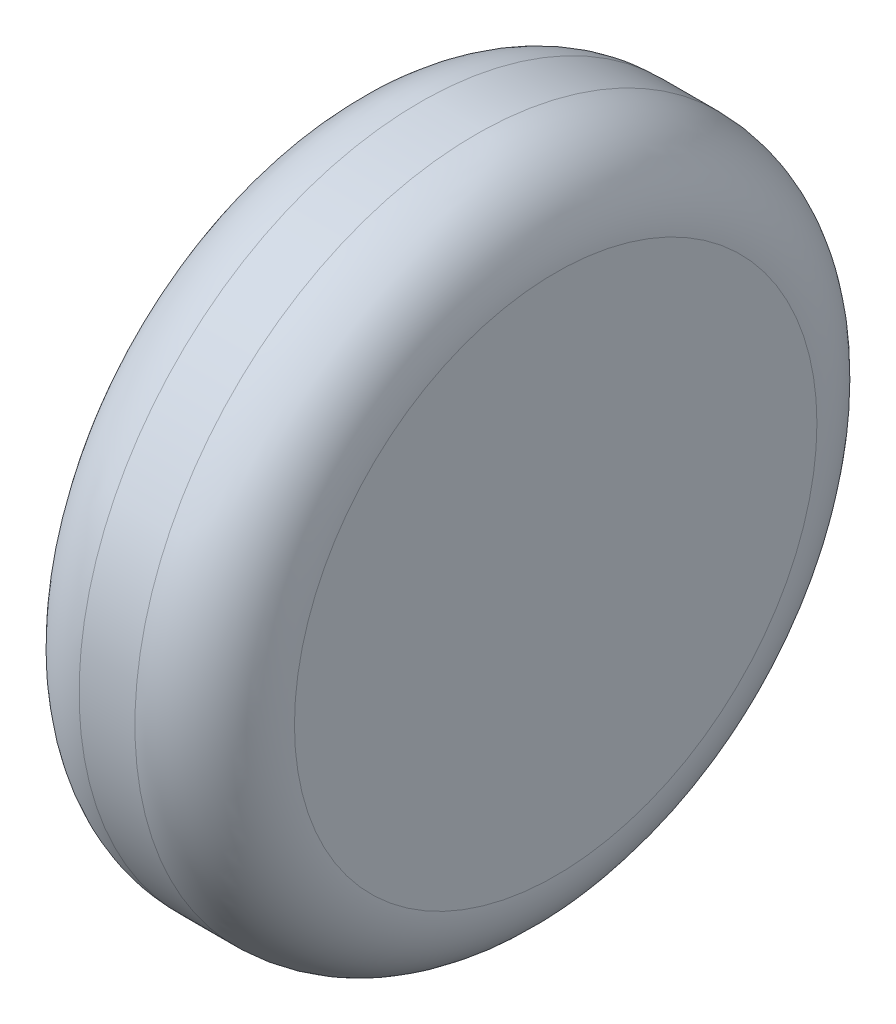
ISO-10303-21;
HEADER;
FILE_DESCRIPTION(('STEP AP214'),'2;1');
FILE_NAME('part.step','',(''),(''),'','','');
FILE_SCHEMA(('AUTOMOTIVE_DESIGN { 1 0 10303 214 1 1 1 1 }'));
ENDSEC;
DATA;
#1=APPLICATION_CONTEXT('core data for automotive mechanical design processes');
#2=APPLICATION_PROTOCOL_DEFINITION('international standard','automotive_design',2000,#1);
#3=PRODUCT_CONTEXT('',#1,'mechanical');
#4=PRODUCT('Part','Part','',(#3));
#5=PRODUCT_RELATED_PRODUCT_CATEGORY('part','',(#4));
#6=PRODUCT_DEFINITION_FORMATION('','',#4);
#7=PRODUCT_DEFINITION_CONTEXT('part definition',#1,'design');
#8=PRODUCT_DEFINITION('design','',#6,#7);
#9=PRODUCT_DEFINITION_SHAPE('','',#8);
#10=(LENGTH_UNIT() NAMED_UNIT(*) SI_UNIT(.MILLI.,.METRE.));
#11=(NAMED_UNIT(*) PLANE_ANGLE_UNIT() SI_UNIT($,.RADIAN.));
#12=(NAMED_UNIT(*) SI_UNIT($,.STERADIAN.) SOLID_ANGLE_UNIT());
#13=UNCERTAINTY_MEASURE_WITH_UNIT(LENGTH_MEASURE(1.E-05),#10,'distance_accuracy_value','');
#14=(GEOMETRIC_REPRESENTATION_CONTEXT(3) GLOBAL_UNCERTAINTY_ASSIGNED_CONTEXT((#13)) GLOBAL_UNIT_ASSIGNED_CONTEXT((#10,
#11,#12)) REPRESENTATION_CONTEXT('',''));
#15=CARTESIAN_POINT('',(0.,0.,0.));
#16=DIRECTION('',(0.,0.,1.));
#17=DIRECTION('',(1.,0.,0.));
#18=AXIS2_PLACEMENT_3D('',#15,#16,#17);
#19=CARTESIAN_POINT('',(24.,0.,0.));
#20=DIRECTION('',(-1.,0.,0.));
#21=DIRECTION('',(0.,0.,1.));
#22=AXIS2_PLACEMENT_3D('',#19,#20,#21);
#23=CYLINDRICAL_SURFACE('',#22,38.);
#24=CARTESIAN_POINT('',(15.11,0.,0.));
#25=DIRECTION('',(1.,0.,0.));
#26=DIRECTION('',(0.,0.,-1.));
#27=AXIS2_PLACEMENT_3D('',#24,#25,#26);
#28=CIRCLE('',#27,38.);
#29=CARTESIAN_POINT('',(15.11,0.,-38.));
#30=VERTEX_POINT('',#29);
#31=EDGE_CURVE('E88',#30,#30,#28,.F.);
#32=ORIENTED_EDGE('',*,*,#31,.T.);
#33=EDGE_LOOP('',(#32));
#34=FACE_BOUND('',#33,.T.);
#35=CARTESIAN_POINT('',(8.89,0.,0.));
#36=DIRECTION('',(1.,0.,0.));
#37=DIRECTION('',(0.,0.,-1.));
#38=AXIS2_PLACEMENT_3D('',#35,#36,#37);
#39=CIRCLE('',#38,38.);
#40=CARTESIAN_POINT('',(8.89,0.,-38.));
#41=VERTEX_POINT('',#40);
#42=EDGE_CURVE('E85',#41,#41,#39,.T.);
#43=ORIENTED_EDGE('',*,*,#42,.T.);
#44=EDGE_LOOP('',(#43));
#45=FACE_BOUND('',#44,.T.);
#46=ADVANCED_FACE('F33',(#34,#45),#23,.T.);
#47=CARTESIAN_POINT('',(24.,0.,0.));
#48=DIRECTION('',(1.,0.,0.));
#49=DIRECTION('',(0.,0.,-1.));
#50=AXIS2_PLACEMENT_3D('',#47,#48,#49);
#51=PLANE('',#50);
#52=CARTESIAN_POINT('',(24.,0.,0.));
#53=DIRECTION('',(1.,0.,0.));
#54=DIRECTION('',(0.,0.,-1.));
#55=AXIS2_PLACEMENT_3D('',#52,#53,#54);
#56=CIRCLE('',#55,29.11);
#57=CARTESIAN_POINT('',(24.,0.,-29.11));
#58=VERTEX_POINT('',#57);
#59=EDGE_CURVE('E82',#58,#58,#56,.T.);
#60=ORIENTED_EDGE('',*,*,#59,.T.);
#61=EDGE_LOOP('',(#60));
#62=FACE_BOUND('',#61,.T.);
#63=ADVANCED_FACE('F102',(#62),#51,.T.);
#64=CARTESIAN_POINT('',(0.,0.,0.));
#65=DIRECTION('',(1.,0.,0.));
#66=DIRECTION('',(0.,0.,-1.));
#67=AXIS2_PLACEMENT_3D('',#64,#65,#66);
#68=PLANE('',#67);
#69=CARTESIAN_POINT('',(0.,0.,0.));
#70=DIRECTION('',(1.,0.,0.));
#71=DIRECTION('',(0.,0.,-1.));
#72=AXIS2_PLACEMENT_3D('',#69,#70,#71);
#73=CIRCLE('',#72,10.922);
#74=CARTESIAN_POINT('',(0.,0.,-10.922));
#75=VERTEX_POINT('',#74);
#76=EDGE_CURVE('E11',#75,#75,#73,.F.);
#77=ORIENTED_EDGE('',*,*,#76,.F.);
#78=EDGE_LOOP('',(#77));
#79=FACE_BOUND('',#78,.T.);
#80=CARTESIAN_POINT('',(0.,0.,0.));
#81=DIRECTION('',(1.,0.,0.));
#82=DIRECTION('',(0.,0.,-1.));
#83=AXIS2_PLACEMENT_3D('',#80,#81,#82);
#84=CIRCLE('',#83,29.11);
#85=CARTESIAN_POINT('',(0.,0.,-29.11));
#86=VERTEX_POINT('',#85);
#87=EDGE_CURVE('E41',#86,#86,#84,.F.);
#88=ORIENTED_EDGE('',*,*,#87,.T.);
#89=EDGE_LOOP('',(#88));
#90=FACE_BOUND('',#89,.T.);
#91=ADVANCED_FACE('F93',(#79,#90),#68,.F.);
#92=CARTESIAN_POINT('',(15.11,0.,0.));
#93=DIRECTION('',(1.,0.,0.));
#94=DIRECTION('',(0.,0.,-1.));
#95=AXIS2_PLACEMENT_3D('',#92,#93,#94);
#96=TOROIDAL_SURFACE('',#95,29.11,8.89);
#97=ORIENTED_EDGE('',*,*,#31,.F.);
#98=EDGE_LOOP('',(#97));
#99=FACE_BOUND('',#98,.T.);
#100=ORIENTED_EDGE('',*,*,#59,.F.);
#101=EDGE_LOOP('',(#100));
#102=FACE_BOUND('',#101,.T.);
#103=ADVANCED_FACE('F98',(#99,#102),#96,.T.);
#104=CARTESIAN_POINT('',(8.89,0.,0.));
#105=DIRECTION('',(1.,0.,0.));
#106=DIRECTION('',(0.,0.,-1.));
#107=AXIS2_PLACEMENT_3D('',#104,#105,#106);
#108=TOROIDAL_SURFACE('',#107,29.11,8.89);
#109=ORIENTED_EDGE('',*,*,#87,.F.);
#110=EDGE_LOOP('',(#109));
#111=FACE_BOUND('',#110,.T.);
#112=ORIENTED_EDGE('',*,*,#42,.F.);
#113=EDGE_LOOP('',(#112));
#114=FACE_BOUND('',#113,.T.);
#115=ADVANCED_FACE('F35',(#111,#114),#108,.T.);
#116=CARTESIAN_POINT('',(-3.302,0.,0.));
#117=DIRECTION('',(1.,0.,0.));
#118=DIRECTION('',(0.,0.,-1.));
#119=AXIS2_PLACEMENT_3D('',#116,#117,#118);
#120=CYLINDRICAL_SURFACE('',#119,10.922);
#121=CARTESIAN_POINT('',(-3.302,0.,0.));
#122=DIRECTION('',(-1.,0.,0.));
#123=DIRECTION('',(0.,0.,1.));
#124=AXIS2_PLACEMENT_3D('',#121,#122,#123);
#125=CIRCLE('',#124,10.922);
#126=CARTESIAN_POINT('',(-3.302,0.,-10.922));
#127=VERTEX_POINT('',#126);
#128=EDGE_CURVE('E64',#127,#127,#125,.T.);
#129=CARTESIAN_POINT('',(-3.302,0.,-10.922));
#130=CARTESIAN_POINT('',(-3.26760416666667,0.,-10.922));
#131=CARTESIAN_POINT('',(-3.23320833333333,0.,-10.922));
#132=CARTESIAN_POINT('',(-3.16441666666667,0.,-10.922));
#133=CARTESIAN_POINT('',(-3.13002083333333,0.,-10.922));
#134=CARTESIAN_POINT('',(-3.06122916666667,0.,-10.922));
#135=CARTESIAN_POINT('',(-3.02683333333333,0.,-10.922));
#136=CARTESIAN_POINT('',(-2.95804166666667,0.,-10.922));
#137=CARTESIAN_POINT('',(-2.92364583333333,0.,-10.922));
#138=CARTESIAN_POINT('',(-2.85485416666667,0.,-10.922));
#139=CARTESIAN_POINT('',(-2.82045833333333,0.,-10.922));
#140=CARTESIAN_POINT('',(-2.75166666666667,0.,-10.922));
#141=CARTESIAN_POINT('',(-2.71727083333333,0.,-10.922));
#142=CARTESIAN_POINT('',(-2.64847916666667,0.,-10.922));
#143=CARTESIAN_POINT('',(-2.61408333333333,0.,-10.922));
#144=CARTESIAN_POINT('',(-2.54529166666667,0.,-10.922));
#145=CARTESIAN_POINT('',(-2.51089583333333,0.,-10.922));
#146=CARTESIAN_POINT('',(-2.44210416666667,0.,-10.922));
#147=CARTESIAN_POINT('',(-2.40770833333333,0.,-10.922));
#148=CARTESIAN_POINT('',(-2.33891666666667,0.,-10.922));
#149=CARTESIAN_POINT('',(-2.30452083333333,0.,-10.922));
#150=CARTESIAN_POINT('',(-2.23572916666667,0.,-10.922));
#151=CARTESIAN_POINT('',(-2.20133333333333,0.,-10.922));
#152=CARTESIAN_POINT('',(-2.13254166666667,0.,-10.922));
#153=CARTESIAN_POINT('',(-2.09814583333333,0.,-10.922));
#154=CARTESIAN_POINT('',(-2.02935416666667,0.,-10.922));
#155=CARTESIAN_POINT('',(-1.99495833333333,0.,-10.922));
#156=CARTESIAN_POINT('',(-1.92616666666667,0.,-10.922));
#157=CARTESIAN_POINT('',(-1.89177083333333,0.,-10.922));
#158=CARTESIAN_POINT('',(-1.82297916666667,0.,-10.922));
#159=CARTESIAN_POINT('',(-1.78858333333333,0.,-10.922));
#160=CARTESIAN_POINT('',(-1.71979166666667,0.,-10.922));
#161=CARTESIAN_POINT('',(-1.68539583333333,0.,-10.922));
#162=CARTESIAN_POINT('',(-1.61660416666667,0.,-10.922));
#163=CARTESIAN_POINT('',(-1.58220833333333,0.,-10.922));
#164=CARTESIAN_POINT('',(-1.51341666666667,0.,-10.922));
#165=CARTESIAN_POINT('',(-1.47902083333333,0.,-10.922));
#166=CARTESIAN_POINT('',(-1.41022916666667,0.,-10.922));
#167=CARTESIAN_POINT('',(-1.37583333333333,0.,-10.922));
#168=CARTESIAN_POINT('',(-1.30704166666667,0.,-10.922));
#169=CARTESIAN_POINT('',(-1.27264583333333,0.,-10.922));
#170=CARTESIAN_POINT('',(-1.20385416666667,0.,-10.922));
#171=CARTESIAN_POINT('',(-1.16945833333333,0.,-10.922));
#172=CARTESIAN_POINT('',(-1.10066666666667,0.,-10.922));
#173=CARTESIAN_POINT('',(-1.06627083333333,0.,-10.922));
#174=CARTESIAN_POINT('',(-0.997479166666667,0.,-10.922));
#175=CARTESIAN_POINT('',(-0.963083333333334,0.,-10.922));
#176=CARTESIAN_POINT('',(-0.894291666666667,0.,-10.922));
#177=CARTESIAN_POINT('',(-0.859895833333333,0.,-10.922));
#178=CARTESIAN_POINT('',(-0.791104166666666,0.,-10.922));
#179=CARTESIAN_POINT('',(-0.756708333333333,0.,-10.922));
#180=CARTESIAN_POINT('',(-0.687916666666667,0.,-10.922));
#181=CARTESIAN_POINT('',(-0.653520833333333,0.,-10.922));
#182=CARTESIAN_POINT('',(-0.584729166666667,0.,-10.922));
#183=CARTESIAN_POINT('',(-0.550333333333333,0.,-10.922));
#184=CARTESIAN_POINT('',(-0.481541666666667,0.,-10.922));
#185=CARTESIAN_POINT('',(-0.447145833333333,0.,-10.922));
#186=CARTESIAN_POINT('',(-0.378354166666667,0.,-10.922));
#187=CARTESIAN_POINT('',(-0.343958333333333,0.,-10.922));
#188=CARTESIAN_POINT('',(-0.275166666666667,0.,-10.922));
#189=CARTESIAN_POINT('',(-0.240770833333333,0.,-10.922));
#190=CARTESIAN_POINT('',(-0.171979166666667,0.,-10.922));
#191=CARTESIAN_POINT('',(-0.137583333333333,0.,-10.922));
#192=CARTESIAN_POINT('',(-0.0687916666666666,0.,-10.922));
#193=CARTESIAN_POINT('',(-0.0343958333333333,0.,-10.922));
#194=CARTESIAN_POINT('',(0.,0.,-10.922));
#195=B_SPLINE_CURVE_WITH_KNOTS('',3,(#129,#130,#131,#132,#133,#134,#135,#136,#137,#138,#139,
#140,#141,#142,#143,#144,#145,#146,#147,#148,#149,#150,#151,#152,#153,#154,#155,#156,#157,#158,
#159,#160,#161,#162,#163,#164,#165,#166,#167,#168,#169,#170,#171,#172,#173,#174,#175,#176,#177,
#178,#179,#180,#181,#182,#183,#184,#185,#186,#187,#188,#189,#190,#191,#192,#193,#194),
.UNSPECIFIED.,.F.,.F.,(4,2,2,2,2,2,2,2,2,2,2,2,2,2,2,2,2,2,2,2,2,2,2,2,2,2,2,2,2,2,2,2,4),(0.,
0.1031875,0.206375,0.3095625,0.41275,0.5159375,0.619125,0.7223125,0.8255,0.9286875,1.031875,
1.1350625,1.23825,1.3414375,1.444625,1.5478125,1.651,1.7541875,1.857375,1.9605625,2.06375,
2.1669375,2.270125,2.3733125,2.4765,2.5796875,2.682875,2.7860625,2.88925,2.9924375,3.095625,
3.1988125,3.302),.UNSPECIFIED.);
#196=EDGE_CURVE('BSEAM97',#127,#75,#195,.T.);
#197=ORIENTED_EDGE('',*,*,#128,.F.);
#198=ORIENTED_EDGE('',*,*,#76,.T.);
#199=ORIENTED_EDGE('',*,*,#196,.T.);
#200=ORIENTED_EDGE('',*,*,#196,.F.);
#201=EDGE_LOOP('',(#197,#199,#198,#200));
#202=FACE_BOUND('',#201,.T.);
#203=ADVANCED_FACE('F97',(#202),#120,.T.);
#204=CARTESIAN_POINT('',(-3.302,0.,0.));
#205=DIRECTION('',(-1.,0.,0.));
#206=DIRECTION('',(0.,0.,1.));
#207=AXIS2_PLACEMENT_3D('',#204,#205,#206);
#208=PLANE('',#207);
#209=CARTESIAN_POINT('',(-3.302,0.,0.));
#210=DIRECTION('',(-1.,0.,0.));
#211=DIRECTION('',(0.,0.,1.));
#212=AXIS2_PLACEMENT_3D('',#209,#210,#211);
#213=CIRCLE('',#212,3.);
#214=CARTESIAN_POINT('',(-3.302,2.5,-1.6583123951777));
#215=VERTEX_POINT('',#214);
#216=CARTESIAN_POINT('',(-3.302,2.5,1.6583123951777));
#217=VERTEX_POINT('',#216);
#218=EDGE_CURVE('E48',#215,#217,#213,.T.);
#219=ORIENTED_EDGE('',*,*,#218,.F.);
#220=DIRECTION('',(0.,0.,-1.));
#221=VECTOR('',#220,1.);
#222=CARTESIAN_POINT('',(-3.302,2.5,-1.6583123951777));
#223=LINE('',#222,#221);
#224=EDGE_CURVE('E68',#217,#215,#223,.T.);
#225=ORIENTED_EDGE('',*,*,#224,.F.);
#226=EDGE_LOOP('',(#219,#225));
#227=FACE_BOUND('',#226,.T.);
#228=ORIENTED_EDGE('',*,*,#128,.T.);
#229=EDGE_LOOP('',(#228));
#230=FACE_BOUND('',#229,.T.);
#231=ADVANCED_FACE('F72',(#227,#230),#208,.T.);
#232=CARTESIAN_POINT('',(14.224,0.,0.));
#233=DIRECTION('',(-1.,0.,0.));
#234=DIRECTION('',(0.,0.,1.));
#235=AXIS2_PLACEMENT_3D('',#232,#233,#234);
#236=CYLINDRICAL_SURFACE('',#235,3.);
#237=ORIENTED_EDGE('',*,*,#218,.T.);
#238=DIRECTION('',(-1.,0.,0.));
#239=VECTOR('',#238,1.);
#240=CARTESIAN_POINT('',(14.224,2.5,1.6583123951777));
#241=LINE('',#240,#239);
#242=CARTESIAN_POINT('',(14.224,2.5,1.6583123951777));
#243=VERTEX_POINT('',#242);
#244=EDGE_CURVE('E65',#243,#217,#241,.T.);
#245=ORIENTED_EDGE('',*,*,#244,.F.);
#246=CARTESIAN_POINT('',(14.224,0.,0.));
#247=DIRECTION('',(-1.,0.,0.));
#248=DIRECTION('',(0.,0.,1.));
#249=AXIS2_PLACEMENT_3D('',#246,#247,#248);
#250=CIRCLE('',#249,3.);
#251=CARTESIAN_POINT('',(14.224,2.5,-1.6583123951777));
#252=VERTEX_POINT('',#251);
#253=EDGE_CURVE('E62',#252,#243,#250,.T.);
#254=ORIENTED_EDGE('',*,*,#253,.F.);
#255=DIRECTION('',(-1.,0.,0.));
#256=VECTOR('',#255,1.);
#257=CARTESIAN_POINT('',(14.224,2.5,-1.6583123951777));
#258=LINE('',#257,#256);
#259=EDGE_CURVE('E56',#252,#215,#258,.T.);
#260=ORIENTED_EDGE('',*,*,#259,.T.);
#261=EDGE_LOOP('',(#237,#245,#254,#260));
#262=FACE_BOUND('',#261,.T.);
#263=ADVANCED_FACE('F60',(#262),#236,.F.);
#264=CARTESIAN_POINT('',(14.224,2.5,-1.6583123951777));
#265=DIRECTION('',(0.,1.,0.));
#266=DIRECTION('',(0.,0.,1.));
#267=AXIS2_PLACEMENT_3D('',#264,#265,#266);
#268=PLANE('',#267);
#269=ORIENTED_EDGE('',*,*,#224,.T.);
#270=ORIENTED_EDGE('',*,*,#259,.F.);
#271=DIRECTION('',(0.,0.,-1.));
#272=VECTOR('',#271,1.);
#273=CARTESIAN_POINT('',(14.224,2.5,-1.6583123951777));
#274=LINE('',#273,#272);
#275=EDGE_CURVE('E76',#243,#252,#274,.T.);
#276=ORIENTED_EDGE('',*,*,#275,.F.);
#277=ORIENTED_EDGE('',*,*,#244,.T.);
#278=EDGE_LOOP('',(#269,#270,#276,#277));
#279=FACE_BOUND('',#278,.T.);
#280=ADVANCED_FACE('F69',(#279),#268,.F.);
#281=CARTESIAN_POINT('',(14.224,0.,0.));
#282=DIRECTION('',(-1.,0.,0.));
#283=DIRECTION('',(0.,0.,1.));
#284=AXIS2_PLACEMENT_3D('',#281,#282,#283);
#285=PLANE('',#284);
#286=ORIENTED_EDGE('',*,*,#253,.T.);
#287=ORIENTED_EDGE('',*,*,#275,.T.);
#288=EDGE_LOOP('',(#286,#287));
#289=FACE_BOUND('',#288,.T.);
#290=ADVANCED_FACE('F137',(#289),#285,.T.);
#291=CLOSED_SHELL('',(#46,#63,#91,#103,#115,#203,#231,#263,#280,#290));
#292=MANIFOLD_SOLID_BREP('B2',#291);
#293=ADVANCED_BREP_SHAPE_REPRESENTATION('',(#18,#292),#14);
#294=SHAPE_DEFINITION_REPRESENTATION(#9,#293);
ENDSEC;
END-ISO-10303-21;
